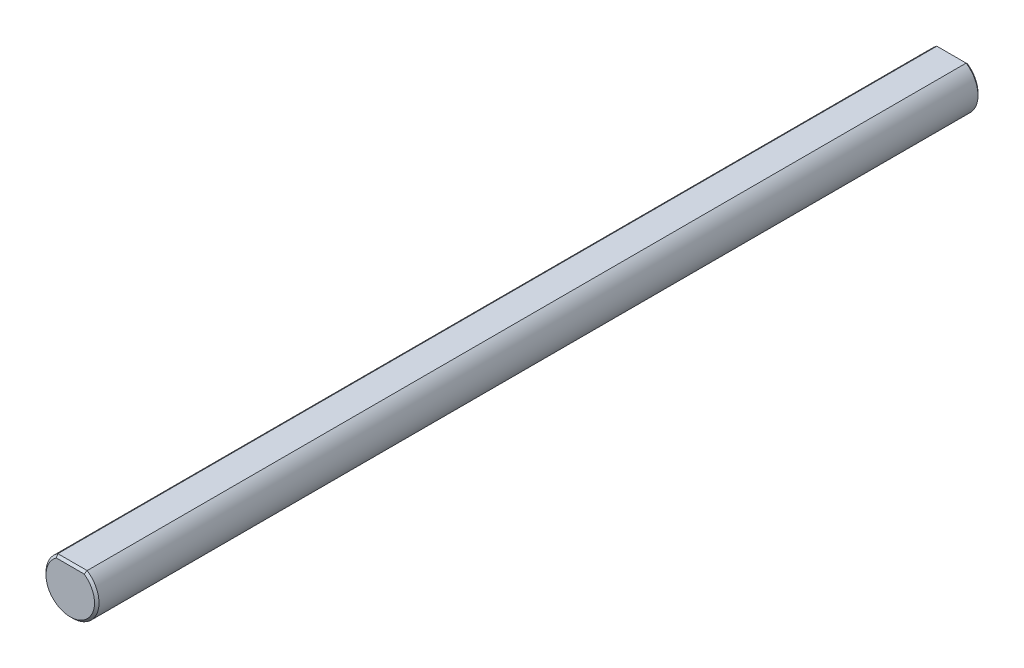
ISO-10303-21;
HEADER;
FILE_DESCRIPTION(('STEP AP214'),'2;1');
FILE_NAME('part.step','',(''),(''),'','','');
FILE_SCHEMA(('AUTOMOTIVE_DESIGN { 1 0 10303 214 1 1 1 1 }'));
ENDSEC;
DATA;
#1=APPLICATION_CONTEXT('core data for automotive mechanical design processes');
#2=APPLICATION_PROTOCOL_DEFINITION('international standard','automotive_design',2000,#1);
#3=PRODUCT_CONTEXT('',#1,'mechanical');
#4=PRODUCT('Part','Part','',(#3));
#5=PRODUCT_RELATED_PRODUCT_CATEGORY('part','',(#4));
#6=PRODUCT_DEFINITION_FORMATION('','',#4);
#7=PRODUCT_DEFINITION_CONTEXT('part definition',#1,'design');
#8=PRODUCT_DEFINITION('design','',#6,#7);
#9=PRODUCT_DEFINITION_SHAPE('','',#8);
#10=(LENGTH_UNIT() NAMED_UNIT(*) SI_UNIT(.MILLI.,.METRE.));
#11=(NAMED_UNIT(*) PLANE_ANGLE_UNIT() SI_UNIT($,.RADIAN.));
#12=(NAMED_UNIT(*) SI_UNIT($,.STERADIAN.) SOLID_ANGLE_UNIT());
#13=UNCERTAINTY_MEASURE_WITH_UNIT(LENGTH_MEASURE(1.E-05),#10,'distance_accuracy_value','');
#14=(GEOMETRIC_REPRESENTATION_CONTEXT(3) GLOBAL_UNCERTAINTY_ASSIGNED_CONTEXT((#13)) GLOBAL_UNIT_ASSIGNED_CONTEXT((#10,
#11,#12)) REPRESENTATION_CONTEXT('',''));
#15=CARTESIAN_POINT('',(0.,0.,0.));
#16=DIRECTION('',(0.,0.,1.));
#17=DIRECTION('',(1.,0.,0.));
#18=AXIS2_PLACEMENT_3D('',#15,#16,#17);
#19=CARTESIAN_POINT('',(0.,0.,0.));
#20=DIRECTION('',(0.,0.,1.));
#21=DIRECTION('',(1.,0.,0.));
#22=AXIS2_PLACEMENT_3D('',#19,#20,#21);
#23=CYLINDRICAL_SURFACE('',#22,3.);
#24=DIRECTION('',(0.,0.,1.));
#25=VECTOR('',#24,1.);
#26=CARTESIAN_POINT('',(-1.6583123951777,2.5,0.));
#27=LINE('',#26,#25);
#28=CARTESIAN_POINT('',(-1.6583123951777,2.5,0.253999999981981));
#29=VERTEX_POINT('',#28);
#30=CARTESIAN_POINT('',(-1.6583123951777,2.5,99.746000000018));
#31=VERTEX_POINT('',#30);
#32=EDGE_CURVE('E89',#29,#31,#27,.T.);
#33=ORIENTED_EDGE('',*,*,#32,.F.);
#34=CARTESIAN_POINT('',(0.,0.,0.253999999981981));
#35=DIRECTION('',(0.,0.,1.));
#36=DIRECTION('',(1.,0.,0.));
#37=AXIS2_PLACEMENT_3D('',#34,#35,#36);
#38=CIRCLE('',#37,3.);
#39=CARTESIAN_POINT('',(1.6583123951777,2.5,0.253999999981981));
#40=VERTEX_POINT('',#39);
#41=EDGE_CURVE('E85',#29,#40,#38,.T.);
#42=ORIENTED_EDGE('',*,*,#41,.T.);
#43=DIRECTION('',(0.,0.,1.));
#44=VECTOR('',#43,1.);
#45=CARTESIAN_POINT('',(1.6583123951777,2.5,0.));
#46=LINE('',#45,#44);
#47=CARTESIAN_POINT('',(1.6583123951777,2.5,99.746000000018));
#48=VERTEX_POINT('',#47);
#49=EDGE_CURVE('E87',#40,#48,#46,.T.);
#50=ORIENTED_EDGE('',*,*,#49,.T.);
#51=CARTESIAN_POINT('',(0.,0.,99.746000000018));
#52=DIRECTION('',(0.,0.,1.));
#53=DIRECTION('',(1.,0.,0.));
#54=AXIS2_PLACEMENT_3D('',#51,#52,#53);
#55=CIRCLE('',#54,3.);
#56=EDGE_CURVE('E94',#48,#31,#55,.F.);
#57=ORIENTED_EDGE('',*,*,#56,.T.);
#58=EDGE_LOOP('',(#33,#42,#50,#57));
#59=FACE_BOUND('',#58,.T.);
#60=ADVANCED_FACE('F37',(#59),#23,.T.);
#61=CARTESIAN_POINT('',(1.6583123951777,2.5,0.));
#62=DIRECTION('',(0.,1.,0.));
#63=DIRECTION('',(0.,0.,1.));
#64=AXIS2_PLACEMENT_3D('',#61,#62,#63);
#65=PLANE('',#64);
#66=ORIENTED_EDGE('',*,*,#49,.F.);
#67=DIRECTION('',(-1.,0.,0.));
#68=VECTOR('',#67,1.);
#69=CARTESIAN_POINT('',(-1.6583123951777,2.5,0.253999999981981));
#70=LINE('',#69,#68);
#71=EDGE_CURVE('E100',#40,#29,#70,.T.);
#72=ORIENTED_EDGE('',*,*,#71,.T.);
#73=ORIENTED_EDGE('',*,*,#32,.T.);
#74=DIRECTION('',(1.,0.,0.));
#75=VECTOR('',#74,1.);
#76=CARTESIAN_POINT('',(1.6583123951777,2.5,99.746000000018));
#77=LINE('',#76,#75);
#78=EDGE_CURVE('E101',#31,#48,#77,.T.);
#79=ORIENTED_EDGE('',*,*,#78,.T.);
#80=EDGE_LOOP('',(#66,#72,#73,#79));
#81=FACE_BOUND('',#80,.T.);
#82=ADVANCED_FACE('F98',(#81),#65,.T.);
#83=CARTESIAN_POINT('',(0.,0.,0.));
#84=DIRECTION('',(0.,0.,1.));
#85=DIRECTION('',(1.,0.,0.));
#86=AXIS2_PLACEMENT_3D('',#83,#84,#85);
#87=PLANE('',#86);
#88=CARTESIAN_POINT('',(0.,0.,0.));
#89=DIRECTION('',(0.,0.,1.));
#90=DIRECTION('',(1.,0.,0.));
#91=AXIS2_PLACEMENT_3D('',#88,#89,#90);
#92=CIRCLE('',#91,2.74600000001801);
#93=CARTESIAN_POINT('',(1.5798734126563,2.24600000001796,0.));
#94=VERTEX_POINT('',#93);
#95=CARTESIAN_POINT('',(-1.5798734126563,2.24600000001796,0.));
#96=VERTEX_POINT('',#95);
#97=EDGE_CURVE('E106',#94,#96,#92,.F.);
#98=ORIENTED_EDGE('',*,*,#97,.T.);
#99=DIRECTION('',(1.,0.,0.));
#100=VECTOR('',#99,1.);
#101=CARTESIAN_POINT('',(1.6583123951777,2.24600000001801,0.));
#102=LINE('',#101,#100);
#103=EDGE_CURVE('E114',#96,#94,#102,.T.);
#104=ORIENTED_EDGE('',*,*,#103,.T.);
#105=EDGE_LOOP('',(#98,#104));
#106=FACE_BOUND('',#105,.T.);
#107=ADVANCED_FACE('F146',(#106),#87,.F.);
#108=CARTESIAN_POINT('',(0.,0.,100.));
#109=DIRECTION('',(0.,0.,1.));
#110=DIRECTION('',(1.,0.,0.));
#111=AXIS2_PLACEMENT_3D('',#108,#109,#110);
#112=PLANE('',#111);
#113=CARTESIAN_POINT('',(0.,0.,100.));
#114=DIRECTION('',(0.,0.,1.));
#115=DIRECTION('',(1.,0.,0.));
#116=AXIS2_PLACEMENT_3D('',#113,#114,#115);
#117=CIRCLE('',#116,2.74600000001803);
#118=CARTESIAN_POINT('',(-1.5798734126563,2.24600000001797,100.));
#119=VERTEX_POINT('',#118);
#120=CARTESIAN_POINT('',(1.5798734126563,2.24600000001797,100.));
#121=VERTEX_POINT('',#120);
#122=EDGE_CURVE('E50',#119,#121,#117,.T.);
#123=ORIENTED_EDGE('',*,*,#122,.T.);
#124=DIRECTION('',(-1.,0.,0.));
#125=VECTOR('',#124,1.);
#126=CARTESIAN_POINT('',(0.,2.24600000001802,100.));
#127=LINE('',#126,#125);
#128=EDGE_CURVE('E11',#121,#119,#127,.T.);
#129=ORIENTED_EDGE('',*,*,#128,.T.);
#130=EDGE_LOOP('',(#123,#129));
#131=FACE_BOUND('',#130,.T.);
#132=ADVANCED_FACE('F144',(#131),#112,.T.);
#133=CARTESIAN_POINT('',(0.,0.,0.253999999981981));
#134=DIRECTION('',(0.,0.,1.));
#135=DIRECTION('',(1.,0.,0.));
#136=AXIS2_PLACEMENT_3D('',#133,#134,#135);
#137=CONICAL_SURFACE('',#136,3.,0.785398163397461);
#138=CARTESIAN_POINT('',(-1.6583123951777,2.5,0.253999999981981));
#139=CARTESIAN_POINT('',(-1.64554145476164,2.45762001362958,0.211620013611566));
#140=CARTESIAN_POINT('',(-1.63261940456067,2.41526335973503,0.169263359717011));
#141=CARTESIAN_POINT('',(-1.60647307722383,2.33059669304807,0.0845966930300583));
#142=CARTESIAN_POINT('',(-1.59324879991769,2.28828668028196,0.0422866802639506));
#143=CARTESIAN_POINT('',(-1.57987341265638,2.24600000001801,0.));
#144=B_SPLINE_CURVE_WITH_KNOTS('',3,(#138,#139,#140,#141,#142,#143),.UNSPECIFIED.,.F.,.F.,(4,2,
4),(0.,0.183837876285447,0.367675856140688),.UNSPECIFIED.);
#145=EDGE_CURVE('E110',#96,#29,#144,.F.);
#146=ORIENTED_EDGE('',*,*,#145,.F.);
#147=ORIENTED_EDGE('',*,*,#97,.F.);
#148=CARTESIAN_POINT('',(1.57987341265633,2.24600000001801,0.));
#149=CARTESIAN_POINT('',(1.59324879991764,2.28828668028197,0.0422866802639579));
#150=CARTESIAN_POINT('',(1.60647307722379,2.33059669304808,0.0845966930300634));
#151=CARTESIAN_POINT('',(1.63261940456071,2.41526335973502,0.169263359717005));
#152=CARTESIAN_POINT('',(1.64554145476173,2.45762001362957,0.211620013611551));
#153=CARTESIAN_POINT('',(1.65831239517787,2.49999999999997,0.253999999981954));
#154=B_SPLINE_CURVE_WITH_KNOTS('',3,(#148,#149,#150,#151,#152,#153),.UNSPECIFIED.,.F.,.F.,(4,2,
4),(0.,0.183837979855241,0.367675856140688),.UNSPECIFIED.);
#155=EDGE_CURVE('E102',#40,#94,#154,.F.);
#156=ORIENTED_EDGE('',*,*,#155,.F.);
#157=ORIENTED_EDGE('',*,*,#41,.F.);
#158=EDGE_LOOP('',(#146,#147,#156,#157));
#159=FACE_BOUND('',#158,.T.);
#160=ADVANCED_FACE('F105',(#159),#137,.T.);
#161=CARTESIAN_POINT('',(1.6583123951777,2.5,0.253999999981981));
#162=DIRECTION('',(0.,0.707106781186538,-0.707106781186557));
#163=DIRECTION('',(1.,0.,0.));
#164=AXIS2_PLACEMENT_3D('',#161,#162,#163);
#165=PLANE('',#164);
#166=ORIENTED_EDGE('',*,*,#155,.T.);
#167=ORIENTED_EDGE('',*,*,#103,.F.);
#168=ORIENTED_EDGE('',*,*,#145,.T.);
#169=ORIENTED_EDGE('',*,*,#71,.F.);
#170=EDGE_LOOP('',(#166,#167,#168,#169));
#171=FACE_BOUND('',#170,.T.);
#172=ADVANCED_FACE('F112',(#171),#165,.T.);
#173=CARTESIAN_POINT('',(0.,0.,100.));
#174=DIRECTION('',(0.,0.,-1.));
#175=DIRECTION('',(-1.,0.,0.));
#176=AXIS2_PLACEMENT_3D('',#173,#174,#175);
#177=CONICAL_SURFACE('',#176,2.74600000001803,0.785398163397444);
#178=CARTESIAN_POINT('',(-1.57987341265634,2.24600000001802,100.));
#179=CARTESIAN_POINT('',(-1.59324879991764,2.28828668028198,99.957713319736));
#180=CARTESIAN_POINT('',(-1.60647307722379,2.33059669304808,99.9154033069699));
#181=CARTESIAN_POINT('',(-1.63261940456071,2.41526335973502,99.830736640283));
#182=CARTESIAN_POINT('',(-1.64554145476173,2.45762001362957,99.7883799863885));
#183=CARTESIAN_POINT('',(-1.65831239517787,2.49999999999997,99.7460000000181));
#184=B_SPLINE_CURVE_WITH_KNOTS('',3,(#178,#179,#180,#181,#182,#183),.UNSPECIFIED.,.F.,.F.,(4,2,
4),(0.,0.183837979855225,0.367675856140674),.UNSPECIFIED.);
#185=EDGE_CURVE('E63',#31,#119,#184,.F.);
#186=ORIENTED_EDGE('',*,*,#185,.F.);
#187=ORIENTED_EDGE('',*,*,#56,.F.);
#188=CARTESIAN_POINT('',(1.6583123951777,2.5,99.746000000018));
#189=CARTESIAN_POINT('',(1.64554145476164,2.45762001362958,99.7883799863884));
#190=CARTESIAN_POINT('',(1.63261940456067,2.41526335973503,99.830736640283));
#191=CARTESIAN_POINT('',(1.60647307722383,2.33059669304808,99.91540330697));
#192=CARTESIAN_POINT('',(1.59324879991769,2.28828668028197,99.9577133197361));
#193=CARTESIAN_POINT('',(1.57987341265638,2.24600000001802,100.));
#194=B_SPLINE_CURVE_WITH_KNOTS('',3,(#188,#189,#190,#191,#192,#193),.UNSPECIFIED.,.F.,.F.,(4,2,
4),(0.,0.18383787628545,0.367675856140682),.UNSPECIFIED.);
#195=EDGE_CURVE('E42',#121,#48,#194,.F.);
#196=ORIENTED_EDGE('',*,*,#195,.F.);
#197=ORIENTED_EDGE('',*,*,#122,.F.);
#198=EDGE_LOOP('',(#186,#187,#196,#197));
#199=FACE_BOUND('',#198,.T.);
#200=ADVANCED_FACE('F133',(#199),#177,.T.);
#201=CARTESIAN_POINT('',(0.,2.24600000001802,100.));
#202=DIRECTION('',(0.,-0.707106781186551,-0.707106781186545));
#203=DIRECTION('',(-1.,0.,0.));
#204=AXIS2_PLACEMENT_3D('',#201,#202,#203);
#205=PLANE('',#204);
#206=ORIENTED_EDGE('',*,*,#195,.T.);
#207=ORIENTED_EDGE('',*,*,#78,.F.);
#208=ORIENTED_EDGE('',*,*,#185,.T.);
#209=ORIENTED_EDGE('',*,*,#128,.F.);
#210=EDGE_LOOP('',(#206,#207,#208,#209));
#211=FACE_BOUND('',#210,.T.);
#212=ADVANCED_FACE('F39',(#211),#205,.F.);
#213=CLOSED_SHELL('',(#60,#82,#107,#132,#160,#172,#200,#212));
#214=MANIFOLD_SOLID_BREP('B2',#213);
#215=ADVANCED_BREP_SHAPE_REPRESENTATION('',(#18,#214),#14);
#216=SHAPE_DEFINITION_REPRESENTATION(#9,#215);
ENDSEC;
END-ISO-10303-21;
